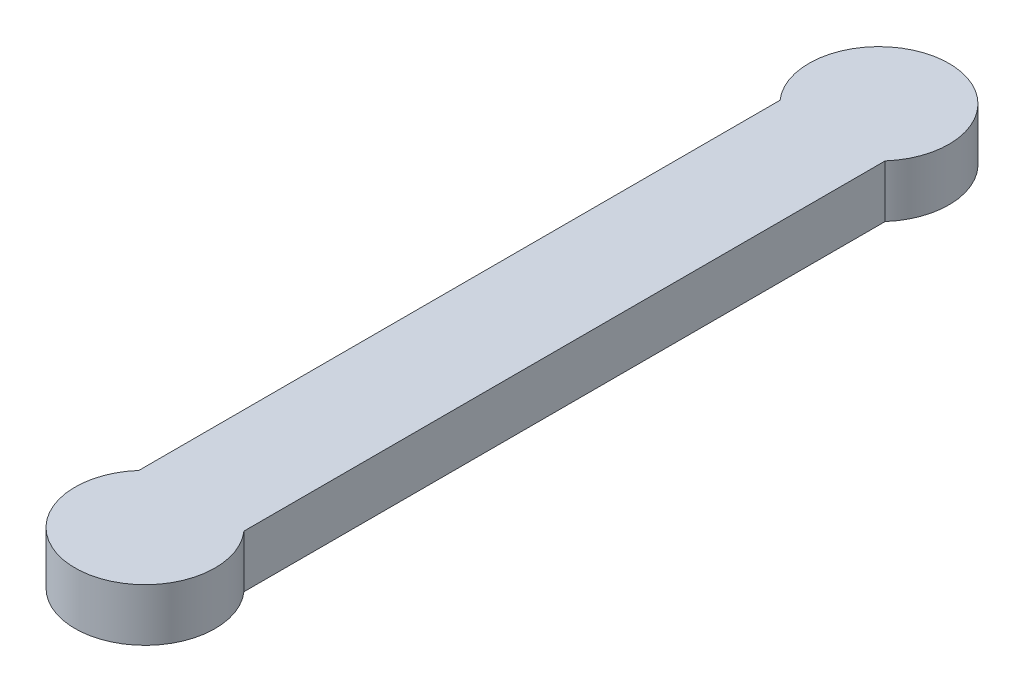
ISO-10303-21;
HEADER;
FILE_DESCRIPTION(('STEP AP214'),'2;1');
FILE_NAME('part.step','',(''),(''),'','','');
FILE_SCHEMA(('AUTOMOTIVE_DESIGN { 1 0 10303 214 1 1 1 1 }'));
ENDSEC;
DATA;
#1=APPLICATION_CONTEXT('core data for automotive mechanical design processes');
#2=APPLICATION_PROTOCOL_DEFINITION('international standard','automotive_design',2000,#1);
#3=PRODUCT_CONTEXT('',#1,'mechanical');
#4=PRODUCT('Part','Part','',(#3));
#5=PRODUCT_RELATED_PRODUCT_CATEGORY('part','',(#4));
#6=PRODUCT_DEFINITION_FORMATION('','',#4);
#7=PRODUCT_DEFINITION_CONTEXT('part definition',#1,'design');
#8=PRODUCT_DEFINITION('design','',#6,#7);
#9=PRODUCT_DEFINITION_SHAPE('','',#8);
#10=(LENGTH_UNIT() NAMED_UNIT(*) SI_UNIT(.MILLI.,.METRE.));
#11=(NAMED_UNIT(*) PLANE_ANGLE_UNIT() SI_UNIT($,.RADIAN.));
#12=(NAMED_UNIT(*) SI_UNIT($,.STERADIAN.) SOLID_ANGLE_UNIT());
#13=UNCERTAINTY_MEASURE_WITH_UNIT(LENGTH_MEASURE(1.E-05),#10,'distance_accuracy_value','');
#14=(GEOMETRIC_REPRESENTATION_CONTEXT(3) GLOBAL_UNCERTAINTY_ASSIGNED_CONTEXT((#13)) GLOBAL_UNIT_ASSIGNED_CONTEXT((#10,
#11,#12)) REPRESENTATION_CONTEXT('',''));
#15=CARTESIAN_POINT('',(0.,0.,0.));
#16=DIRECTION('',(0.,0.,1.));
#17=DIRECTION('',(1.,0.,0.));
#18=AXIS2_PLACEMENT_3D('',#15,#16,#17);
#19=CARTESIAN_POINT('',(0.,3.,-41.9));
#20=DIRECTION('',(0.,-1.,0.));
#21=DIRECTION('',(0.,0.,-1.));
#22=AXIS2_PLACEMENT_3D('',#19,#20,#21);
#23=CYLINDRICAL_SURFACE('',#22,4.);
#24=CARTESIAN_POINT('',(0.,0.,-41.9));
#25=DIRECTION('',(0.,1.,0.));
#26=DIRECTION('',(0.,0.,1.));
#27=AXIS2_PLACEMENT_3D('',#24,#25,#26);
#28=CIRCLE('',#27,4.);
#29=CARTESIAN_POINT('',(3.,0.,-39.2542486889354));
#30=VERTEX_POINT('',#29);
#31=CARTESIAN_POINT('',(-3.,0.,-39.2542486889354));
#32=VERTEX_POINT('',#31);
#33=EDGE_CURVE('E98',#30,#32,#28,.T.);
#34=ORIENTED_EDGE('',*,*,#33,.T.);
#35=DIRECTION('',(0.,-1.,0.));
#36=VECTOR('',#35,1.);
#37=CARTESIAN_POINT('',(-3.,3.,-39.2542486889354));
#38=LINE('',#37,#36);
#39=CARTESIAN_POINT('',(-3.,3.,-39.2542486889354));
#40=VERTEX_POINT('',#39);
#41=EDGE_CURVE('E11',#40,#32,#38,.T.);
#42=ORIENTED_EDGE('',*,*,#41,.F.);
#43=CARTESIAN_POINT('',(0.,3.,-41.9));
#44=DIRECTION('',(0.,1.,0.));
#45=DIRECTION('',(0.,0.,1.));
#46=AXIS2_PLACEMENT_3D('',#43,#44,#45);
#47=CIRCLE('',#46,4.);
#48=CARTESIAN_POINT('',(3.,3.,-39.2542486889354));
#49=VERTEX_POINT('',#48);
#50=EDGE_CURVE('E86',#49,#40,#47,.T.);
#51=ORIENTED_EDGE('',*,*,#50,.F.);
#52=DIRECTION('',(0.,-1.,0.));
#53=VECTOR('',#52,1.);
#54=CARTESIAN_POINT('',(3.,3.,-39.2542486889354));
#55=LINE('',#54,#53);
#56=EDGE_CURVE('E94',#49,#30,#55,.T.);
#57=ORIENTED_EDGE('',*,*,#56,.T.);
#58=EDGE_LOOP('',(#34,#42,#51,#57));
#59=FACE_BOUND('',#58,.T.);
#60=ADVANCED_FACE('F35',(#59),#23,.T.);
#61=CARTESIAN_POINT('',(-3.,3.,-39.2542486889354));
#62=DIRECTION('',(1.,0.,0.));
#63=DIRECTION('',(0.,0.,-1.));
#64=AXIS2_PLACEMENT_3D('',#61,#62,#63);
#65=PLANE('',#64);
#66=DIRECTION('',(0.,0.,1.));
#67=VECTOR('',#66,1.);
#68=CARTESIAN_POINT('',(-3.,0.,-39.2542486889354));
#69=LINE('',#68,#67);
#70=CARTESIAN_POINT('',(-3.,0.,-2.6457513110646));
#71=VERTEX_POINT('',#70);
#72=EDGE_CURVE('E90',#32,#71,#69,.T.);
#73=ORIENTED_EDGE('',*,*,#72,.T.);
#74=DIRECTION('',(0.,-1.,0.));
#75=VECTOR('',#74,1.);
#76=CARTESIAN_POINT('',(-3.,3.,-2.6457513110646));
#77=LINE('',#76,#75);
#78=CARTESIAN_POINT('',(-3.,3.,-2.6457513110646));
#79=VERTEX_POINT('',#78);
#80=EDGE_CURVE('E43',#79,#71,#77,.T.);
#81=ORIENTED_EDGE('',*,*,#80,.F.);
#82=DIRECTION('',(0.,0.,1.));
#83=VECTOR('',#82,1.);
#84=CARTESIAN_POINT('',(-3.,3.,-39.2542486889354));
#85=LINE('',#84,#83);
#86=EDGE_CURVE('E81',#40,#79,#85,.T.);
#87=ORIENTED_EDGE('',*,*,#86,.F.);
#88=ORIENTED_EDGE('',*,*,#41,.T.);
#89=EDGE_LOOP('',(#73,#81,#87,#88));
#90=FACE_BOUND('',#89,.T.);
#91=ADVANCED_FACE('F89',(#90),#65,.F.);
#92=CARTESIAN_POINT('',(0.,3.,0.));
#93=DIRECTION('',(0.,-1.,0.));
#94=DIRECTION('',(0.,0.,-1.));
#95=AXIS2_PLACEMENT_3D('',#92,#93,#94);
#96=CYLINDRICAL_SURFACE('',#95,4.);
#97=CARTESIAN_POINT('',(0.,0.,0.));
#98=DIRECTION('',(0.,1.,0.));
#99=DIRECTION('',(0.,0.,1.));
#100=AXIS2_PLACEMENT_3D('',#97,#98,#99);
#101=CIRCLE('',#100,4.);
#102=CARTESIAN_POINT('',(3.,0.,-2.64575131106459));
#103=VERTEX_POINT('',#102);
#104=EDGE_CURVE('E68',#71,#103,#101,.T.);
#105=ORIENTED_EDGE('',*,*,#104,.T.);
#106=DIRECTION('',(0.,-1.,0.));
#107=VECTOR('',#106,1.);
#108=CARTESIAN_POINT('',(3.,3.,-2.64575131106459));
#109=LINE('',#108,#107);
#110=CARTESIAN_POINT('',(3.,3.,-2.64575131106459));
#111=VERTEX_POINT('',#110);
#112=EDGE_CURVE('E91',#111,#103,#109,.T.);
#113=ORIENTED_EDGE('',*,*,#112,.F.);
#114=CARTESIAN_POINT('',(0.,3.,0.));
#115=DIRECTION('',(0.,1.,0.));
#116=DIRECTION('',(0.,0.,1.));
#117=AXIS2_PLACEMENT_3D('',#114,#115,#116);
#118=CIRCLE('',#117,4.);
#119=EDGE_CURVE('E84',#79,#111,#118,.T.);
#120=ORIENTED_EDGE('',*,*,#119,.F.);
#121=ORIENTED_EDGE('',*,*,#80,.T.);
#122=EDGE_LOOP('',(#105,#113,#120,#121));
#123=FACE_BOUND('',#122,.T.);
#124=ADVANCED_FACE('F92',(#123),#96,.T.);
#125=CARTESIAN_POINT('',(3.,3.,-39.2542486889354));
#126=DIRECTION('',(-1.,0.,0.));
#127=DIRECTION('',(0.,0.,1.));
#128=AXIS2_PLACEMENT_3D('',#125,#126,#127);
#129=PLANE('',#128);
#130=DIRECTION('',(0.,0.,-1.));
#131=VECTOR('',#130,1.);
#132=CARTESIAN_POINT('',(3.,0.,-39.2542486889354));
#133=LINE('',#132,#131);
#134=EDGE_CURVE('E74',#103,#30,#133,.T.);
#135=ORIENTED_EDGE('',*,*,#134,.T.);
#136=ORIENTED_EDGE('',*,*,#56,.F.);
#137=DIRECTION('',(0.,0.,-1.));
#138=VECTOR('',#137,1.);
#139=CARTESIAN_POINT('',(3.,3.,-39.2542486889354));
#140=LINE('',#139,#138);
#141=EDGE_CURVE('E51',#111,#49,#140,.T.);
#142=ORIENTED_EDGE('',*,*,#141,.F.);
#143=ORIENTED_EDGE('',*,*,#112,.T.);
#144=EDGE_LOOP('',(#135,#136,#142,#143));
#145=FACE_BOUND('',#144,.T.);
#146=ADVANCED_FACE('F105',(#145),#129,.F.);
#147=CARTESIAN_POINT('',(0.,3.,-41.9));
#148=DIRECTION('',(0.,1.,0.));
#149=DIRECTION('',(0.,0.,1.));
#150=AXIS2_PLACEMENT_3D('',#147,#148,#149);
#151=PLANE('',#150);
#152=ORIENTED_EDGE('',*,*,#50,.T.);
#153=ORIENTED_EDGE('',*,*,#86,.T.);
#154=ORIENTED_EDGE('',*,*,#119,.T.);
#155=ORIENTED_EDGE('',*,*,#141,.T.);
#156=EDGE_LOOP('',(#152,#153,#154,#155));
#157=FACE_BOUND('',#156,.T.);
#158=ADVANCED_FACE('F82',(#157),#151,.T.);
#159=CARTESIAN_POINT('',(0.,0.,-41.9));
#160=DIRECTION('',(0.,1.,0.));
#161=DIRECTION('',(0.,0.,1.));
#162=AXIS2_PLACEMENT_3D('',#159,#160,#161);
#163=PLANE('',#162);
#164=ORIENTED_EDGE('',*,*,#33,.F.);
#165=ORIENTED_EDGE('',*,*,#134,.F.);
#166=ORIENTED_EDGE('',*,*,#104,.F.);
#167=ORIENTED_EDGE('',*,*,#72,.F.);
#168=EDGE_LOOP('',(#164,#165,#166,#167));
#169=FACE_BOUND('',#168,.T.);
#170=ADVANCED_FACE('F108',(#169),#163,.F.);
#171=CLOSED_SHELL('',(#60,#91,#124,#146,#158,#170));
#172=MANIFOLD_SOLID_BREP('B2',#171);
#173=ADVANCED_BREP_SHAPE_REPRESENTATION('',(#18,#172),#14);
#174=SHAPE_DEFINITION_REPRESENTATION(#9,#173);
ENDSEC;
END-ISO-10303-21;
